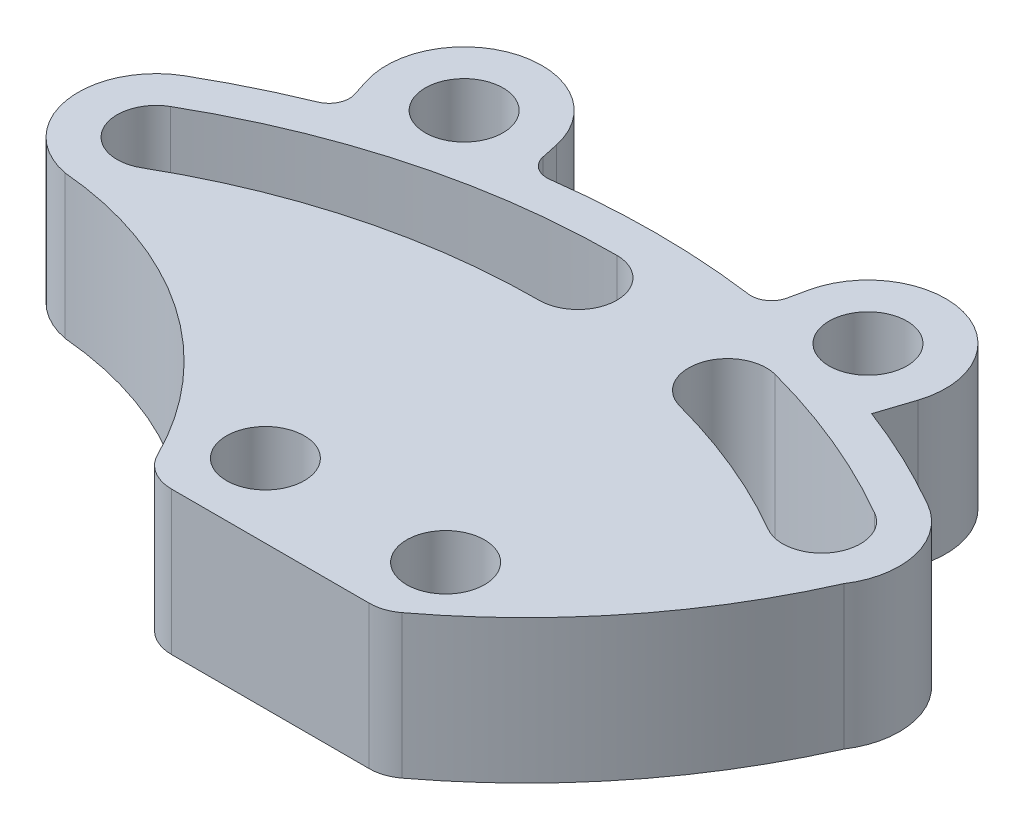
ISO-10303-21;
HEADER;
FILE_DESCRIPTION(('STEP AP214'),'2;1');
FILE_NAME('part.step','',(''),(''),'','','');
FILE_SCHEMA(('AUTOMOTIVE_DESIGN { 1 0 10303 214 1 1 1 1 }'));
ENDSEC;
DATA;
#1=APPLICATION_CONTEXT('core data for automotive mechanical design processes');
#2=APPLICATION_PROTOCOL_DEFINITION('international standard','automotive_design',2000,#1);
#3=PRODUCT_CONTEXT('',#1,'mechanical');
#4=PRODUCT('Part','Part','',(#3));
#5=PRODUCT_RELATED_PRODUCT_CATEGORY('part','',(#4));
#6=PRODUCT_DEFINITION_FORMATION('','',#4);
#7=PRODUCT_DEFINITION_CONTEXT('part definition',#1,'design');
#8=PRODUCT_DEFINITION('design','',#6,#7);
#9=PRODUCT_DEFINITION_SHAPE('','',#8);
#10=(LENGTH_UNIT() NAMED_UNIT(*) SI_UNIT(.MILLI.,.METRE.));
#11=(NAMED_UNIT(*) PLANE_ANGLE_UNIT() SI_UNIT($,.RADIAN.));
#12=(NAMED_UNIT(*) SI_UNIT($,.STERADIAN.) SOLID_ANGLE_UNIT());
#13=UNCERTAINTY_MEASURE_WITH_UNIT(LENGTH_MEASURE(1.E-05),#10,'distance_accuracy_value','');
#14=(GEOMETRIC_REPRESENTATION_CONTEXT(3) GLOBAL_UNCERTAINTY_ASSIGNED_CONTEXT((#13)) GLOBAL_UNIT_ASSIGNED_CONTEXT((#10,
#11,#12)) REPRESENTATION_CONTEXT('',''));
#15=CARTESIAN_POINT('',(0.,0.,0.));
#16=DIRECTION('',(0.,0.,1.));
#17=DIRECTION('',(1.,0.,0.));
#18=AXIS2_PLACEMENT_3D('',#15,#16,#17);
#19=CARTESIAN_POINT('',(21.3655121732125,17.78,-35.2871769601627));
#20=DIRECTION('',(0.,-1.,0.));
#21=DIRECTION('',(0.,0.,-1.));
#22=AXIS2_PLACEMENT_3D('',#19,#20,#21);
#23=CYLINDRICAL_SURFACE('',#22,4.826);
#24=CARTESIAN_POINT('',(21.3655121732125,0.,-35.2871769601627));
#25=DIRECTION('',(0.,1.,0.));
#26=DIRECTION('',(0.,0.,1.));
#27=AXIS2_PLACEMENT_3D('',#24,#25,#26);
#28=CIRCLE('',#27,4.826);
#29=CARTESIAN_POINT('',(22.6145728848773,0.,-39.9487349978338));
#30=VERTEX_POINT('',#29);
#31=CARTESIAN_POINT('',(20.1164514615478,0.,-30.6256189224917));
#32=VERTEX_POINT('',#31);
#33=EDGE_CURVE('E363',#30,#32,#28,.T.);
#34=ORIENTED_EDGE('',*,*,#33,.F.);
#35=DIRECTION('',(0.,-1.,0.));
#36=VECTOR('',#35,1.);
#37=CARTESIAN_POINT('',(22.6145728848773,17.78,-39.9487349978338));
#38=LINE('',#37,#36);
#39=CARTESIAN_POINT('',(22.6145728848773,17.78,-39.9487349978338));
#40=VERTEX_POINT('',#39);
#41=EDGE_CURVE('E11',#40,#30,#38,.T.);
#42=ORIENTED_EDGE('',*,*,#41,.F.);
#43=CARTESIAN_POINT('',(21.3655121732125,17.78,-35.2871769601627));
#44=DIRECTION('',(0.,1.,0.));
#45=DIRECTION('',(0.,0.,1.));
#46=AXIS2_PLACEMENT_3D('',#43,#44,#45);
#47=CIRCLE('',#46,4.826);
#48=CARTESIAN_POINT('',(20.1164514615478,17.78,-30.6256189224917));
#49=VERTEX_POINT('',#48);
#50=EDGE_CURVE('E248',#40,#49,#47,.T.);
#51=ORIENTED_EDGE('',*,*,#50,.T.);
#52=DIRECTION('',(0.,-1.,0.));
#53=VECTOR('',#52,1.);
#54=CARTESIAN_POINT('',(20.1164514615478,17.78,-30.6256189224917));
#55=LINE('',#54,#53);
#56=EDGE_CURVE('E154',#49,#32,#55,.T.);
#57=ORIENTED_EDGE('',*,*,#56,.T.);
#58=EDGE_LOOP('',(#34,#42,#51,#57));
#59=FACE_BOUND('',#58,.T.);
#60=ADVANCED_FACE('F43',(#59),#23,.F.);
#61=CARTESIAN_POINT('',(0.,17.78,44.45));
#62=DIRECTION('',(0.,-1.,0.));
#63=DIRECTION('',(0.,0.,-1.));
#64=AXIS2_PLACEMENT_3D('',#61,#62,#63);
#65=CYLINDRICAL_SURFACE('',#64,87.376);
#66=CARTESIAN_POINT('',(0.,0.,44.45));
#67=DIRECTION('',(0.,1.,0.));
#68=DIRECTION('',(0.,0.,1.));
#69=AXIS2_PLACEMENT_3D('',#66,#67,#68);
#70=CIRCLE('',#69,87.376);
#71=CARTESIAN_POINT('',(43.6879999999995,0.,-31.2198356810694));
#72=VERTEX_POINT('',#71);
#73=EDGE_CURVE('E238',#72,#30,#70,.T.);
#74=ORIENTED_EDGE('',*,*,#73,.F.);
#75=DIRECTION('',(0.,-1.,0.));
#76=VECTOR('',#75,1.);
#77=CARTESIAN_POINT('',(43.6879999999995,17.78,-31.2198356810694));
#78=LINE('',#77,#76);
#79=CARTESIAN_POINT('',(43.6879999999995,17.78,-31.2198356810694));
#80=VERTEX_POINT('',#79);
#81=EDGE_CURVE('E54',#80,#72,#78,.T.);
#82=ORIENTED_EDGE('',*,*,#81,.F.);
#83=CARTESIAN_POINT('',(0.,17.78,44.45));
#84=DIRECTION('',(0.,1.,0.));
#85=DIRECTION('',(0.,0.,1.));
#86=AXIS2_PLACEMENT_3D('',#83,#84,#85);
#87=CIRCLE('',#86,87.376);
#88=EDGE_CURVE('E236',#80,#40,#87,.T.);
#89=ORIENTED_EDGE('',*,*,#88,.T.);
#90=ORIENTED_EDGE('',*,*,#41,.T.);
#91=EDGE_LOOP('',(#74,#82,#89,#90));
#92=FACE_BOUND('',#91,.T.);
#93=ADVANCED_FACE('F235',(#92),#65,.F.);
#94=CARTESIAN_POINT('',(41.2749999999996,17.78,-27.0403970824057));
#95=DIRECTION('',(0.,-1.,0.));
#96=DIRECTION('',(0.,0.,-1.));
#97=AXIS2_PLACEMENT_3D('',#94,#95,#96);
#98=CYLINDRICAL_SURFACE('',#97,4.826);
#99=CARTESIAN_POINT('',(41.2749999999996,0.,-27.0403970824057));
#100=DIRECTION('',(0.,1.,0.));
#101=DIRECTION('',(0.,0.,1.));
#102=AXIS2_PLACEMENT_3D('',#99,#100,#101);
#103=CIRCLE('',#102,4.826);
#104=CARTESIAN_POINT('',(38.8619999999996,0.,-22.860958483742));
#105=VERTEX_POINT('',#104);
#106=EDGE_CURVE('E369',#105,#72,#103,.T.);
#107=ORIENTED_EDGE('',*,*,#106,.F.);
#108=DIRECTION('',(0.,-1.,0.));
#109=VECTOR('',#108,1.);
#110=CARTESIAN_POINT('',(38.8619999999996,17.78,-22.860958483742));
#111=LINE('',#110,#109);
#112=CARTESIAN_POINT('',(38.8619999999996,17.78,-22.860958483742));
#113=VERTEX_POINT('',#112);
#114=EDGE_CURVE('E147',#113,#105,#111,.T.);
#115=ORIENTED_EDGE('',*,*,#114,.F.);
#116=CARTESIAN_POINT('',(41.2749999999996,17.78,-27.0403970824057));
#117=DIRECTION('',(0.,1.,0.));
#118=DIRECTION('',(0.,0.,1.));
#119=AXIS2_PLACEMENT_3D('',#116,#117,#118);
#120=CIRCLE('',#119,4.826);
#121=EDGE_CURVE('E247',#113,#80,#120,.T.);
#122=ORIENTED_EDGE('',*,*,#121,.T.);
#123=ORIENTED_EDGE('',*,*,#81,.T.);
#124=EDGE_LOOP('',(#107,#115,#122,#123));
#125=FACE_BOUND('',#124,.T.);
#126=ADVANCED_FACE('F251',(#125),#98,.F.);
#127=CARTESIAN_POINT('',(-41.2749999999996,17.78,-27.0403970824057));
#128=DIRECTION('',(0.,-1.,0.));
#129=DIRECTION('',(0.,0.,-1.));
#130=AXIS2_PLACEMENT_3D('',#127,#128,#129);
#131=CYLINDRICAL_SURFACE('',#130,4.82599999999998);
#132=CARTESIAN_POINT('',(-41.2749999999996,0.,-27.0403970824057));
#133=DIRECTION('',(0.,1.,0.));
#134=DIRECTION('',(0.,0.,1.));
#135=AXIS2_PLACEMENT_3D('',#132,#133,#134);
#136=CIRCLE('',#135,4.82599999999998);
#137=CARTESIAN_POINT('',(-43.6879999999995,0.,-31.2198356810694));
#138=VERTEX_POINT('',#137);
#139=CARTESIAN_POINT('',(-38.8619999999996,0.,-22.860958483742));
#140=VERTEX_POINT('',#139);
#141=EDGE_CURVE('E347',#138,#140,#136,.T.);
#142=ORIENTED_EDGE('',*,*,#141,.F.);
#143=DIRECTION('',(0.,-1.,0.));
#144=VECTOR('',#143,1.);
#145=CARTESIAN_POINT('',(-43.6879999999995,17.78,-31.2198356810694));
#146=LINE('',#145,#144);
#147=CARTESIAN_POINT('',(-43.6879999999995,17.78,-31.2198356810694));
#148=VERTEX_POINT('',#147);
#149=EDGE_CURVE('E386',#148,#138,#146,.T.);
#150=ORIENTED_EDGE('',*,*,#149,.F.);
#151=CARTESIAN_POINT('',(-41.2749999999996,17.78,-27.0403970824057));
#152=DIRECTION('',(0.,1.,0.));
#153=DIRECTION('',(0.,0.,1.));
#154=AXIS2_PLACEMENT_3D('',#151,#152,#153);
#155=CIRCLE('',#154,4.82599999999998);
#156=CARTESIAN_POINT('',(-38.8619999999996,17.78,-22.860958483742));
#157=VERTEX_POINT('',#156);
#158=EDGE_CURVE('E614',#148,#157,#155,.T.);
#159=ORIENTED_EDGE('',*,*,#158,.T.);
#160=DIRECTION('',(0.,-1.,0.));
#161=VECTOR('',#160,1.);
#162=CARTESIAN_POINT('',(-38.8619999999996,17.78,-22.860958483742));
#163=LINE('',#162,#161);
#164=EDGE_CURVE('E389',#157,#140,#163,.T.);
#165=ORIENTED_EDGE('',*,*,#164,.T.);
#166=EDGE_LOOP('',(#142,#150,#159,#165));
#167=FACE_BOUND('',#166,.T.);
#168=ADVANCED_FACE('F660',(#167),#131,.F.);
#169=CARTESIAN_POINT('',(0.,17.78,44.45));
#170=DIRECTION('',(0.,-1.,0.));
#171=DIRECTION('',(0.,0.,-1.));
#172=AXIS2_PLACEMENT_3D('',#169,#170,#171);
#173=CYLINDRICAL_SURFACE('',#172,87.376);
#174=CARTESIAN_POINT('',(0.,0.,44.45));
#175=DIRECTION('',(0.,1.,0.));
#176=DIRECTION('',(0.,0.,1.));
#177=AXIS2_PLACEMENT_3D('',#174,#175,#176);
#178=CIRCLE('',#177,87.376);
#179=CARTESIAN_POINT('',(6.70347033469834E-13,0.,-42.926));
#180=VERTEX_POINT('',#179);
#181=EDGE_CURVE('E351',#180,#138,#178,.T.);
#182=ORIENTED_EDGE('',*,*,#181,.F.);
#183=DIRECTION('',(0.,-1.,0.));
#184=VECTOR('',#183,1.);
#185=CARTESIAN_POINT('',(6.70347033469834E-13,17.78,-42.926));
#186=LINE('',#185,#184);
#187=CARTESIAN_POINT('',(6.70347033469834E-13,17.78,-42.926));
#188=VERTEX_POINT('',#187);
#189=EDGE_CURVE('E395',#188,#180,#186,.T.);
#190=ORIENTED_EDGE('',*,*,#189,.F.);
#191=CARTESIAN_POINT('',(0.,17.78,44.45));
#192=DIRECTION('',(0.,1.,0.));
#193=DIRECTION('',(0.,0.,1.));
#194=AXIS2_PLACEMENT_3D('',#191,#192,#193);
#195=CIRCLE('',#194,87.376);
#196=EDGE_CURVE('E618',#188,#148,#195,.T.);
#197=ORIENTED_EDGE('',*,*,#196,.T.);
#198=ORIENTED_EDGE('',*,*,#149,.T.);
#199=EDGE_LOOP('',(#182,#190,#197,#198));
#200=FACE_BOUND('',#199,.T.);
#201=ADVANCED_FACE('F656',(#200),#173,.F.);
#202=CARTESIAN_POINT('',(6.38378239159465E-13,17.78,-38.1));
#203=DIRECTION('',(0.,-1.,0.));
#204=DIRECTION('',(0.,0.,-1.));
#205=AXIS2_PLACEMENT_3D('',#202,#203,#204);
#206=CYLINDRICAL_SURFACE('',#205,4.82599999999998);
#207=CARTESIAN_POINT('',(6.38378239159465E-13,0.,-38.1));
#208=DIRECTION('',(0.,1.,0.));
#209=DIRECTION('',(0.,0.,1.));
#210=AXIS2_PLACEMENT_3D('',#207,#208,#209);
#211=CIRCLE('',#210,4.82599999999998);
#212=CARTESIAN_POINT('',(5.61780680723873E-13,0.,-33.274));
#213=VERTEX_POINT('',#212);
#214=EDGE_CURVE('E355',#213,#180,#211,.T.);
#215=ORIENTED_EDGE('',*,*,#214,.F.);
#216=DIRECTION('',(0.,-1.,0.));
#217=VECTOR('',#216,1.);
#218=CARTESIAN_POINT('',(5.61780680723873E-13,17.78,-33.274));
#219=LINE('',#218,#217);
#220=CARTESIAN_POINT('',(5.61780680723873E-13,17.78,-33.274));
#221=VERTEX_POINT('',#220);
#222=EDGE_CURVE('E392',#221,#213,#219,.T.);
#223=ORIENTED_EDGE('',*,*,#222,.F.);
#224=CARTESIAN_POINT('',(6.38378239159465E-13,17.78,-38.1));
#225=DIRECTION('',(0.,1.,0.));
#226=DIRECTION('',(0.,0.,1.));
#227=AXIS2_PLACEMENT_3D('',#224,#225,#226);
#228=CIRCLE('',#227,4.82599999999998);
#229=EDGE_CURVE('E622',#221,#188,#228,.T.);
#230=ORIENTED_EDGE('',*,*,#229,.T.);
#231=ORIENTED_EDGE('',*,*,#189,.T.);
#232=EDGE_LOOP('',(#215,#223,#230,#231));
#233=FACE_BOUND('',#232,.T.);
#234=ADVANCED_FACE('F653',(#233),#206,.F.);
#235=CARTESIAN_POINT('',(25.0469542707506,17.78,-49.0265059132985));
#236=DIRECTION('',(0.,-1.,0.));
#237=DIRECTION('',(0.,0.,-1.));
#238=AXIS2_PLACEMENT_3D('',#235,#236,#237);
#239=CYLINDRICAL_SURFACE('',#238,9.652);
#240=CARTESIAN_POINT('',(25.0469542707506,0.,-49.0265059132985));
#241=DIRECTION('',(0.,1.,0.));
#242=DIRECTION('',(0.,0.,1.));
#243=AXIS2_PLACEMENT_3D('',#240,#241,#242);
#244=CIRCLE('',#243,9.652);
#245=CARTESIAN_POINT('',(15.6108599782656,0.,-51.0565868238364));
#246=VERTEX_POINT('',#245);
#247=CARTESIAN_POINT('',(34.2338920958171,0.,-46.0665604073197));
#248=VERTEX_POINT('',#247);
#249=EDGE_CURVE('E267',#246,#248,#244,.F.);
#250=ORIENTED_EDGE('',*,*,#249,.F.);
#251=DIRECTION('',(0.,-1.,0.));
#252=VECTOR('',#251,1.);
#253=CARTESIAN_POINT('',(15.6108599782656,17.78,-51.0565868238364));
#254=LINE('',#253,#252);
#255=CARTESIAN_POINT('',(15.6108599782656,17.78,-51.0565868238364));
#256=VERTEX_POINT('',#255);
#257=EDGE_CURVE('E47',#256,#246,#254,.T.);
#258=ORIENTED_EDGE('',*,*,#257,.F.);
#259=CARTESIAN_POINT('',(25.0469542707506,17.78,-49.0265059132985));
#260=DIRECTION('',(0.,1.,0.));
#261=DIRECTION('',(0.,0.,1.));
#262=AXIS2_PLACEMENT_3D('',#259,#260,#261);
#263=CIRCLE('',#262,9.652);
#264=CARTESIAN_POINT('',(34.2338920958171,17.78,-46.0665604073197));
#265=VERTEX_POINT('',#264);
#266=EDGE_CURVE('E383',#256,#265,#263,.F.);
#267=ORIENTED_EDGE('',*,*,#266,.T.);
#268=DIRECTION('',(0.,-1.,0.));
#269=VECTOR('',#268,1.);
#270=CARTESIAN_POINT('',(34.2338920958171,17.78,-46.0665604073197));
#271=LINE('',#270,#269);
#272=EDGE_CURVE('E266',#265,#248,#271,.T.);
#273=ORIENTED_EDGE('',*,*,#272,.T.);
#274=EDGE_LOOP('',(#250,#258,#267,#273));
#275=FACE_BOUND('',#274,.T.);
#276=ADVANCED_FACE('F45',(#275),#239,.T.);
#277=CARTESIAN_POINT('',(4.42188051072425,17.78,0.951323178346111));
#278=DIRECTION('',(0.977630987617603,0.,0.210327487623065));
#279=DIRECTION('',(0.210327487623065,0.,-0.977630987617603));
#280=AXIS2_PLACEMENT_3D('',#277,#278,#279);
#281=PLANE('',#280);
#282=DIRECTION('',(-0.210327487623065,0.,0.977630987617603));
#283=VECTOR('',#282,1.);
#284=CARTESIAN_POINT('',(4.42188051072425,0.,0.951323178346111));
#285=LINE('',#284,#283);
#286=CARTESIAN_POINT('',(15.1484819945726,0.,-48.9073905872487));
#287=VERTEX_POINT('',#286);
#288=EDGE_CURVE('E271',#246,#287,#285,.T.);
#289=ORIENTED_EDGE('',*,*,#288,.T.);
#290=DIRECTION('',(0.,-1.,0.));
#291=VECTOR('',#290,1.);
#292=CARTESIAN_POINT('',(15.1484819945726,17.78,-48.9073905872487));
#293=LINE('',#292,#291);
#294=CARTESIAN_POINT('',(15.1484819945726,17.78,-48.9073905872487));
#295=VERTEX_POINT('',#294);
#296=EDGE_CURVE('E452',#295,#287,#293,.T.);
#297=ORIENTED_EDGE('',*,*,#296,.F.);
#298=DIRECTION('',(-0.210327487623065,0.,0.977630987617603));
#299=VECTOR('',#298,1.);
#300=CARTESIAN_POINT('',(4.42188051072425,17.78,0.951323178346111));
#301=LINE('',#300,#299);
#302=EDGE_CURVE('E463',#256,#295,#301,.T.);
#303=ORIENTED_EDGE('',*,*,#302,.F.);
#304=ORIENTED_EDGE('',*,*,#257,.T.);
#305=EDGE_LOOP('',(#289,#297,#303,#304));
#306=FACE_BOUND('',#305,.T.);
#307=ADVANCED_FACE('F462',(#306),#281,.F.);
#308=CARTESIAN_POINT('',(12.6652992860238,17.78,-49.4416224058113));
#309=DIRECTION('',(0.,-1.,0.));
#310=DIRECTION('',(0.,0.,-1.));
#311=AXIS2_PLACEMENT_3D('',#308,#309,#310);
#312=CYLINDRICAL_SURFACE('',#311,2.53999999999999);
#313=CARTESIAN_POINT('',(12.6652992860238,0.,-49.4416224058113));
#314=DIRECTION('',(0.,1.,0.));
#315=DIRECTION('',(0.,0.,1.));
#316=AXIS2_PLACEMENT_3D('',#313,#314,#315);
#317=CIRCLE('',#316,2.53999999999999);
#318=CARTESIAN_POINT('',(12.3257470263449,0.,-46.9244207327332));
#319=VERTEX_POINT('',#318);
#320=EDGE_CURVE('E274',#287,#319,#317,.F.);
#321=ORIENTED_EDGE('',*,*,#320,.T.);
#322=DIRECTION('',(0.,-1.,0.));
#323=VECTOR('',#322,1.);
#324=CARTESIAN_POINT('',(12.3257470263449,17.78,-46.9244207327332));
#325=LINE('',#324,#323);
#326=CARTESIAN_POINT('',(12.3257470263449,17.78,-46.9244207327332));
#327=VERTEX_POINT('',#326);
#328=EDGE_CURVE('E449',#327,#319,#325,.T.);
#329=ORIENTED_EDGE('',*,*,#328,.F.);
#330=CARTESIAN_POINT('',(12.6652992860238,17.78,-49.4416224058113));
#331=DIRECTION('',(0.,1.,0.));
#332=DIRECTION('',(0.,0.,1.));
#333=AXIS2_PLACEMENT_3D('',#330,#331,#332);
#334=CIRCLE('',#333,2.53999999999999);
#335=EDGE_CURVE('E565',#295,#327,#334,.F.);
#336=ORIENTED_EDGE('',*,*,#335,.F.);
#337=ORIENTED_EDGE('',*,*,#296,.T.);
#338=EDGE_LOOP('',(#321,#329,#336,#337));
#339=FACE_BOUND('',#338,.T.);
#340=ADVANCED_FACE('F564',(#339),#312,.F.);
#341=CARTESIAN_POINT('',(0.,17.78,44.45));
#342=DIRECTION('',(0.,-1.,0.));
#343=DIRECTION('',(0.,0.,-1.));
#344=AXIS2_PLACEMENT_3D('',#341,#342,#343);
#345=CYLINDRICAL_SURFACE('',#344,92.202);
#346=CARTESIAN_POINT('',(0.,0.,44.45));
#347=DIRECTION('',(0.,1.,0.));
#348=DIRECTION('',(0.,0.,1.));
#349=AXIS2_PLACEMENT_3D('',#346,#347,#348);
#350=CIRCLE('',#349,92.202);
#351=CARTESIAN_POINT('',(-12.3257470263449,0.,-46.9244207327332));
#352=VERTEX_POINT('',#351);
#353=EDGE_CURVE('E277',#319,#352,#350,.T.);
#354=ORIENTED_EDGE('',*,*,#353,.T.);
#355=DIRECTION('',(0.,-1.,0.));
#356=VECTOR('',#355,1.);
#357=CARTESIAN_POINT('',(-12.3257470263449,17.78,-46.9244207327332));
#358=LINE('',#357,#356);
#359=CARTESIAN_POINT('',(-12.3257470263449,17.78,-46.9244207327332));
#360=VERTEX_POINT('',#359);
#361=EDGE_CURVE('E446',#360,#352,#358,.T.);
#362=ORIENTED_EDGE('',*,*,#361,.F.);
#363=CARTESIAN_POINT('',(0.,17.78,44.45));
#364=DIRECTION('',(0.,1.,0.));
#365=DIRECTION('',(0.,0.,1.));
#366=AXIS2_PLACEMENT_3D('',#363,#364,#365);
#367=CIRCLE('',#366,92.202);
#368=EDGE_CURVE('E563',#327,#360,#367,.T.);
#369=ORIENTED_EDGE('',*,*,#368,.F.);
#370=ORIENTED_EDGE('',*,*,#328,.T.);
#371=EDGE_LOOP('',(#354,#362,#369,#370));
#372=FACE_BOUND('',#371,.T.);
#373=ADVANCED_FACE('F561',(#372),#345,.T.);
#374=CARTESIAN_POINT('',(-12.6652992860239,17.78,-49.4416224058113));
#375=DIRECTION('',(0.,-1.,0.));
#376=DIRECTION('',(0.,0.,-1.));
#377=AXIS2_PLACEMENT_3D('',#374,#375,#376);
#378=CYLINDRICAL_SURFACE('',#377,2.54000000000001);
#379=CARTESIAN_POINT('',(-12.6652992860239,0.,-49.4416224058113));
#380=DIRECTION('',(0.,1.,0.));
#381=DIRECTION('',(0.,0.,1.));
#382=AXIS2_PLACEMENT_3D('',#379,#380,#381);
#383=CIRCLE('',#382,2.54000000000001);
#384=CARTESIAN_POINT('',(-15.1484819945726,0.,-48.9073905872487));
#385=VERTEX_POINT('',#384);
#386=EDGE_CURVE('E281',#385,#352,#383,.T.);
#387=ORIENTED_EDGE('',*,*,#386,.F.);
#388=DIRECTION('',(0.,-1.,0.));
#389=VECTOR('',#388,1.);
#390=CARTESIAN_POINT('',(-15.1484819945726,17.78,-48.9073905872487));
#391=LINE('',#390,#389);
#392=CARTESIAN_POINT('',(-15.1484819945726,17.78,-48.9073905872487));
#393=VERTEX_POINT('',#392);
#394=EDGE_CURVE('E443',#393,#385,#391,.T.);
#395=ORIENTED_EDGE('',*,*,#394,.F.);
#396=CARTESIAN_POINT('',(-12.6652992860239,17.78,-49.4416224058113));
#397=DIRECTION('',(0.,1.,0.));
#398=DIRECTION('',(0.,0.,1.));
#399=AXIS2_PLACEMENT_3D('',#396,#397,#398);
#400=CIRCLE('',#399,2.54000000000001);
#401=EDGE_CURVE('E558',#393,#360,#400,.T.);
#402=ORIENTED_EDGE('',*,*,#401,.T.);
#403=ORIENTED_EDGE('',*,*,#361,.T.);
#404=EDGE_LOOP('',(#387,#395,#402,#403));
#405=FACE_BOUND('',#404,.T.);
#406=ADVANCED_FACE('F556',(#405),#378,.F.);
#407=CARTESIAN_POINT('',(-4.42188051072322,17.78,0.951323178345984));
#408=DIRECTION('',(0.977630987617598,0.,-0.210327487623085));
#409=DIRECTION('',(-0.210327487623085,0.,-0.977630987617599));
#410=AXIS2_PLACEMENT_3D('',#407,#408,#409);
#411=PLANE('',#410);
#412=DIRECTION('',(0.210327487623085,0.,0.977630987617599));
#413=VECTOR('',#412,1.);
#414=CARTESIAN_POINT('',(-4.42188051072322,0.,0.951323178345984));
#415=LINE('',#414,#413);
#416=CARTESIAN_POINT('',(-15.6108599782656,0.,-51.0565868238363));
#417=VERTEX_POINT('',#416);
#418=EDGE_CURVE('E285',#417,#385,#415,.T.);
#419=ORIENTED_EDGE('',*,*,#418,.F.);
#420=DIRECTION('',(0.,-1.,0.));
#421=VECTOR('',#420,1.);
#422=CARTESIAN_POINT('',(-15.6108599782656,17.78,-51.0565868238363));
#423=LINE('',#422,#421);
#424=CARTESIAN_POINT('',(-15.6108599782656,17.78,-51.0565868238363));
#425=VERTEX_POINT('',#424);
#426=EDGE_CURVE('E440',#425,#417,#423,.T.);
#427=ORIENTED_EDGE('',*,*,#426,.F.);
#428=DIRECTION('',(0.210327487623085,0.,0.977630987617599));
#429=VECTOR('',#428,1.);
#430=CARTESIAN_POINT('',(-4.42188051072322,17.78,0.951323178345984));
#431=LINE('',#430,#429);
#432=EDGE_CURVE('E552',#425,#393,#431,.T.);
#433=ORIENTED_EDGE('',*,*,#432,.T.);
#434=ORIENTED_EDGE('',*,*,#394,.T.);
#435=EDGE_LOOP('',(#419,#427,#433,#434));
#436=FACE_BOUND('',#435,.T.);
#437=ADVANCED_FACE('F549',(#436),#411,.T.);
#438=CARTESIAN_POINT('',(-25.0469542707507,17.78,-49.0265059132985));
#439=DIRECTION('',(0.,-1.,0.));
#440=DIRECTION('',(0.,0.,-1.));
#441=AXIS2_PLACEMENT_3D('',#438,#439,#440);
#442=CYLINDRICAL_SURFACE('',#441,9.65200000000003);
#443=CARTESIAN_POINT('',(-25.0469542707507,0.,-49.0265059132985));
#444=DIRECTION('',(0.,1.,0.));
#445=DIRECTION('',(0.,0.,1.));
#446=AXIS2_PLACEMENT_3D('',#443,#444,#445);
#447=CIRCLE('',#446,9.65200000000003);
#448=CARTESIAN_POINT('',(-34.2338920958171,0.,-46.0665604073197));
#449=VERTEX_POINT('',#448);
#450=EDGE_CURVE('E289',#449,#417,#447,.F.);
#451=ORIENTED_EDGE('',*,*,#450,.F.);
#452=DIRECTION('',(0.,-1.,0.));
#453=VECTOR('',#452,1.);
#454=CARTESIAN_POINT('',(-34.2338920958171,17.78,-46.0665604073197));
#455=LINE('',#454,#453);
#456=CARTESIAN_POINT('',(-34.2338920958171,17.78,-46.0665604073197));
#457=VERTEX_POINT('',#456);
#458=EDGE_CURVE('E437',#457,#449,#455,.T.);
#459=ORIENTED_EDGE('',*,*,#458,.F.);
#460=CARTESIAN_POINT('',(-25.0469542707507,17.78,-49.0265059132985));
#461=DIRECTION('',(0.,1.,0.));
#462=DIRECTION('',(0.,0.,1.));
#463=AXIS2_PLACEMENT_3D('',#460,#461,#462);
#464=CIRCLE('',#463,9.65200000000003);
#465=EDGE_CURVE('E545',#457,#425,#464,.F.);
#466=ORIENTED_EDGE('',*,*,#465,.T.);
#467=ORIENTED_EDGE('',*,*,#426,.T.);
#468=EDGE_LOOP('',(#451,#459,#466,#467));
#469=FACE_BOUND('',#468,.T.);
#470=ADVANCED_FACE('F544',(#469),#442,.T.);
#471=CARTESIAN_POINT('',(-17.5679988233699,17.78,5.66024503011145));
#472=DIRECTION('',(0.951817014615251,0.,-0.306666546413056));
#473=DIRECTION('',(-0.306666546413056,0.,-0.951817014615251));
#474=AXIS2_PLACEMENT_3D('',#471,#472,#473);
#475=PLANE('',#474);
#476=DIRECTION('',(0.306666546413056,0.,0.951817014615251));
#477=VECTOR('',#476,1.);
#478=CARTESIAN_POINT('',(-17.5679988233699,0.,5.66024503011145));
#479=LINE('',#478,#477);
#480=CARTESIAN_POINT('',(-33.5597250575521,0.,-43.9741128768703));
#481=VERTEX_POINT('',#480);
#482=EDGE_CURVE('E293',#449,#481,#479,.T.);
#483=ORIENTED_EDGE('',*,*,#482,.T.);
#484=DIRECTION('',(0.,-1.,0.));
#485=VECTOR('',#484,1.);
#486=CARTESIAN_POINT('',(-33.5597250575521,17.78,-43.9741128768703));
#487=LINE('',#486,#485);
#488=CARTESIAN_POINT('',(-33.5597250575521,17.78,-43.9741128768703));
#489=VERTEX_POINT('',#488);
#490=EDGE_CURVE('E434',#489,#481,#487,.T.);
#491=ORIENTED_EDGE('',*,*,#490,.F.);
#492=DIRECTION('',(0.306666546413056,0.,0.951817014615251));
#493=VECTOR('',#492,1.);
#494=CARTESIAN_POINT('',(-17.5679988233699,17.78,5.66024503011145));
#495=LINE('',#494,#493);
#496=EDGE_CURVE('E540',#457,#489,#495,.T.);
#497=ORIENTED_EDGE('',*,*,#496,.F.);
#498=ORIENTED_EDGE('',*,*,#458,.T.);
#499=EDGE_LOOP('',(#483,#491,#497,#498));
#500=FACE_BOUND('',#499,.T.);
#501=ADVANCED_FACE('F539',(#500),#475,.F.);
#502=CARTESIAN_POINT('',(-35.9773402746749,17.78,-43.1951798489812));
#503=DIRECTION('',(0.,-1.,0.));
#504=DIRECTION('',(0.,0.,-1.));
#505=AXIS2_PLACEMENT_3D('',#502,#503,#504);
#506=CYLINDRICAL_SURFACE('',#505,2.54000000000002);
#507=CARTESIAN_POINT('',(-35.9773402746749,0.,-43.1951798489812));
#508=DIRECTION('',(0.,1.,0.));
#509=DIRECTION('',(0.,0.,1.));
#510=AXIS2_PLACEMENT_3D('',#507,#508,#509);
#511=CIRCLE('',#510,2.54000000000002);
#512=CARTESIAN_POINT('',(-35.0128003209303,0.,-40.8454431238074));
#513=VERTEX_POINT('',#512);
#514=EDGE_CURVE('E297',#513,#481,#511,.T.);
#515=ORIENTED_EDGE('',*,*,#514,.F.);
#516=DIRECTION('',(0.,-1.,0.));
#517=VECTOR('',#516,1.);
#518=CARTESIAN_POINT('',(-35.0128003209303,17.78,-40.8454431238074));
#519=LINE('',#518,#517);
#520=CARTESIAN_POINT('',(-35.0128003209303,17.78,-40.8454431238074));
#521=VERTEX_POINT('',#520);
#522=EDGE_CURVE('E431',#521,#513,#519,.T.);
#523=ORIENTED_EDGE('',*,*,#522,.F.);
#524=CARTESIAN_POINT('',(-35.9773402746749,17.78,-43.1951798489812));
#525=DIRECTION('',(0.,1.,0.));
#526=DIRECTION('',(0.,0.,1.));
#527=AXIS2_PLACEMENT_3D('',#524,#525,#526);
#528=CIRCLE('',#527,2.54000000000002);
#529=EDGE_CURVE('E536',#521,#489,#528,.T.);
#530=ORIENTED_EDGE('',*,*,#529,.T.);
#531=ORIENTED_EDGE('',*,*,#490,.T.);
#532=EDGE_LOOP('',(#515,#523,#530,#531));
#533=FACE_BOUND('',#532,.T.);
#534=ADVANCED_FACE('F532',(#533),#506,.F.);
#535=CARTESIAN_POINT('',(0.,17.78,44.45));
#536=DIRECTION('',(0.,-1.,0.));
#537=DIRECTION('',(0.,0.,-1.));
#538=AXIS2_PLACEMENT_3D('',#535,#536,#537);
#539=CYLINDRICAL_SURFACE('',#538,92.202);
#540=CARTESIAN_POINT('',(0.,0.,44.45));
#541=DIRECTION('',(0.,1.,0.));
#542=DIRECTION('',(0.,0.,1.));
#543=AXIS2_PLACEMENT_3D('',#540,#541,#542);
#544=CIRCLE('',#543,92.202);
#545=CARTESIAN_POINT('',(-46.1009999999995,0.,-35.3992742797331));
#546=VERTEX_POINT('',#545);
#547=EDGE_CURVE('E301',#546,#513,#544,.F.);
#548=ORIENTED_EDGE('',*,*,#547,.F.);
#549=DIRECTION('',(0.,-1.,0.));
#550=VECTOR('',#549,1.);
#551=CARTESIAN_POINT('',(-46.1009999999995,17.78,-35.3992742797331));
#552=LINE('',#551,#550);
#553=CARTESIAN_POINT('',(-46.1009999999995,17.78,-35.3992742797331));
#554=VERTEX_POINT('',#553);
#555=EDGE_CURVE('E428',#554,#546,#552,.T.);
#556=ORIENTED_EDGE('',*,*,#555,.F.);
#557=CARTESIAN_POINT('',(0.,17.78,44.45));
#558=DIRECTION('',(0.,1.,0.));
#559=DIRECTION('',(0.,0.,1.));
#560=AXIS2_PLACEMENT_3D('',#557,#558,#559);
#561=CIRCLE('',#560,92.202);
#562=EDGE_CURVE('E527',#554,#521,#561,.F.);
#563=ORIENTED_EDGE('',*,*,#562,.T.);
#564=ORIENTED_EDGE('',*,*,#522,.T.);
#565=EDGE_LOOP('',(#548,#556,#563,#564));
#566=FACE_BOUND('',#565,.T.);
#567=ADVANCED_FACE('F526',(#566),#539,.T.);
#568=CARTESIAN_POINT('',(-41.2749999999996,17.78,-27.0403970824057));
#569=DIRECTION('',(0.,-1.,0.));
#570=DIRECTION('',(0.,0.,-1.));
#571=AXIS2_PLACEMENT_3D('',#568,#569,#570);
#572=CYLINDRICAL_SURFACE('',#571,9.65199999999997);
#573=CARTESIAN_POINT('',(-41.2749999999996,0.,-27.0403970824057));
#574=DIRECTION('',(0.,1.,0.));
#575=DIRECTION('',(0.,0.,1.));
#576=AXIS2_PLACEMENT_3D('',#573,#574,#575);
#577=CIRCLE('',#576,9.65199999999997);
#578=CARTESIAN_POINT('',(-43.07696377623,0.,-17.5580961723336));
#579=VERTEX_POINT('',#578);
#580=EDGE_CURVE('E305',#546,#579,#577,.T.);
#581=ORIENTED_EDGE('',*,*,#580,.T.);
#582=DIRECTION('',(0.,-1.,0.));
#583=VECTOR('',#582,1.);
#584=CARTESIAN_POINT('',(-43.07696377623,17.78,-17.5580961723336));
#585=LINE('',#584,#583);
#586=CARTESIAN_POINT('',(-43.07696377623,17.78,-17.5580961723336));
#587=VERTEX_POINT('',#586);
#588=EDGE_CURVE('E424',#587,#579,#585,.T.);
#589=ORIENTED_EDGE('',*,*,#588,.F.);
#590=CARTESIAN_POINT('',(-41.2749999999996,17.78,-27.0403970824057));
#591=DIRECTION('',(0.,1.,0.));
#592=DIRECTION('',(0.,0.,1.));
#593=AXIS2_PLACEMENT_3D('',#590,#591,#592);
#594=CIRCLE('',#593,9.65199999999997);
#595=EDGE_CURVE('E522',#554,#587,#594,.T.);
#596=ORIENTED_EDGE('',*,*,#595,.F.);
#597=ORIENTED_EDGE('',*,*,#555,.T.);
#598=EDGE_LOOP('',(#581,#589,#596,#597));
#599=FACE_BOUND('',#598,.T.);
#600=ADVANCED_FACE('F521',(#599),#572,.T.);
#601=CARTESIAN_POINT('',(-46.8857601776321,17.78,26.7284206242336));
#602=DIRECTION('',(0.,-1.,0.));
#603=DIRECTION('',(0.,0.,-1.));
#604=AXIS2_PLACEMENT_3D('',#601,#602,#603);
#605=CYLINDRICAL_SURFACE('',#604,44.4499999999994);
#606=CARTESIAN_POINT('',(-46.8857601776321,0.,26.7284206242336));
#607=DIRECTION('',(0.,1.,0.));
#608=DIRECTION('',(0.,0.,1.));
#609=AXIS2_PLACEMENT_3D('',#606,#607,#608);
#610=CIRCLE('',#609,44.4499999999994);
#611=CARTESIAN_POINT('',(-7.06547001440866,0.,6.97628171937983));
#612=VERTEX_POINT('',#611);
#613=EDGE_CURVE('E308',#579,#612,#610,.F.);
#614=ORIENTED_EDGE('',*,*,#613,.T.);
#615=DIRECTION('',(0.,-1.,0.));
#616=VECTOR('',#615,1.);
#617=CARTESIAN_POINT('',(-7.06547001440866,17.78,6.97628171937983));
#618=LINE('',#617,#616);
#619=CARTESIAN_POINT('',(-7.06547001440866,17.78,6.97628171937983));
#620=VERTEX_POINT('',#619);
#621=EDGE_CURVE('E421',#620,#612,#618,.T.);
#622=ORIENTED_EDGE('',*,*,#621,.F.);
#623=CARTESIAN_POINT('',(-46.8857601776321,17.78,26.7284206242336));
#624=DIRECTION('',(0.,1.,0.));
#625=DIRECTION('',(0.,0.,1.));
#626=AXIS2_PLACEMENT_3D('',#623,#624,#625);
#627=CIRCLE('',#626,44.4499999999994);
#628=EDGE_CURVE('E518',#587,#620,#627,.F.);
#629=ORIENTED_EDGE('',*,*,#628,.F.);
#630=ORIENTED_EDGE('',*,*,#588,.T.);
#631=EDGE_LOOP('',(#614,#622,#629,#630));
#632=FACE_BOUND('',#631,.T.);
#633=ADVANCED_FACE('F515',(#632),#605,.F.);
#634=CARTESIAN_POINT('',(-2.51457971003822,17.78,4.71889441596698));
#635=DIRECTION('',(0.,-1.,0.));
#636=DIRECTION('',(0.,0.,-1.));
#637=AXIS2_PLACEMENT_3D('',#634,#635,#636);
#638=CYLINDRICAL_SURFACE('',#637,5.08000000000172);
#639=CARTESIAN_POINT('',(-2.51457971003822,0.,4.71889441596698));
#640=DIRECTION('',(0.,1.,0.));
#641=DIRECTION('',(0.,0.,1.));
#642=AXIS2_PLACEMENT_3D('',#639,#640,#641);
#643=CIRCLE('',#642,5.08000000000172);
#644=CARTESIAN_POINT('',(-2.51457971004034,0.,9.79889441596805));
#645=VERTEX_POINT('',#644);
#646=EDGE_CURVE('E312',#645,#612,#643,.F.);
#647=ORIENTED_EDGE('',*,*,#646,.F.);
#648=DIRECTION('',(0.,-1.,0.));
#649=VECTOR('',#648,1.);
#650=CARTESIAN_POINT('',(-2.51457971004034,17.78,9.79889441596805));
#651=LINE('',#650,#649);
#652=CARTESIAN_POINT('',(-2.51457971004034,17.78,9.79889441596805));
#653=VERTEX_POINT('',#652);
#654=EDGE_CURVE('E418',#653,#645,#651,.T.);
#655=ORIENTED_EDGE('',*,*,#654,.F.);
#656=CARTESIAN_POINT('',(-2.51457971003822,17.78,4.71889441596698));
#657=DIRECTION('',(0.,1.,0.));
#658=DIRECTION('',(0.,0.,1.));
#659=AXIS2_PLACEMENT_3D('',#656,#657,#658);
#660=CIRCLE('',#659,5.08000000000172);
#661=EDGE_CURVE('E509',#653,#620,#660,.F.);
#662=ORIENTED_EDGE('',*,*,#661,.T.);
#663=ORIENTED_EDGE('',*,*,#621,.T.);
#664=EDGE_LOOP('',(#647,#655,#662,#663));
#665=FACE_BOUND('',#664,.T.);
#666=ADVANCED_FACE('F508',(#665),#638,.T.);
#667=CARTESIAN_POINT('',(6.19750946284831E-13,17.78,9.79889441596789));
#668=DIRECTION('',(0.,0.,-1.));
#669=DIRECTION('',(-1.,0.,0.));
#670=AXIS2_PLACEMENT_3D('',#667,#668,#669);
#671=PLANE('',#670);
#672=DIRECTION('',(1.,0.,0.));
#673=VECTOR('',#672,1.);
#674=CARTESIAN_POINT('',(6.19750946284831E-13,0.,9.79889441596789));
#675=LINE('',#674,#673);
#676=CARTESIAN_POINT('',(22.0058261429935,0.,9.7988944159665));
#677=VERTEX_POINT('',#676);
#678=EDGE_CURVE('E316',#645,#677,#675,.T.);
#679=ORIENTED_EDGE('',*,*,#678,.T.);
#680=DIRECTION('',(0.,-1.,0.));
#681=VECTOR('',#680,1.);
#682=CARTESIAN_POINT('',(22.0058261429935,17.78,9.7988944159665));
#683=LINE('',#682,#681);
#684=CARTESIAN_POINT('',(22.0058261429935,17.78,9.7988944159665));
#685=VERTEX_POINT('',#684);
#686=EDGE_CURVE('E414',#685,#677,#683,.T.);
#687=ORIENTED_EDGE('',*,*,#686,.F.);
#688=DIRECTION('',(1.,0.,0.));
#689=VECTOR('',#688,1.);
#690=CARTESIAN_POINT('',(6.19750946284831E-13,17.78,9.79889441596789));
#691=LINE('',#690,#689);
#692=EDGE_CURVE('E504',#653,#685,#691,.T.);
#693=ORIENTED_EDGE('',*,*,#692,.F.);
#694=ORIENTED_EDGE('',*,*,#654,.T.);
#695=EDGE_LOOP('',(#679,#687,#693,#694));
#696=FACE_BOUND('',#695,.T.);
#697=ADVANCED_FACE('F503',(#696),#671,.F.);
#698=CARTESIAN_POINT('',(22.0058261429934,17.78,4.7188944159665));
#699=DIRECTION('',(0.,-1.,0.));
#700=DIRECTION('',(0.,0.,-1.));
#701=AXIS2_PLACEMENT_3D('',#698,#699,#700);
#702=CYLINDRICAL_SURFACE('',#701,5.08000000000062);
#703=CARTESIAN_POINT('',(22.0058261429934,0.,4.7188944159665));
#704=DIRECTION('',(0.,1.,0.));
#705=DIRECTION('',(0.,0.,1.));
#706=AXIS2_PLACEMENT_3D('',#703,#704,#705);
#707=CIRCLE('',#706,5.08000000000062);
#708=CARTESIAN_POINT('',(25.0606048013998,0.,8.7778015777721));
#709=VERTEX_POINT('',#708);
#710=EDGE_CURVE('E319',#677,#709,#707,.T.);
#711=ORIENTED_EDGE('',*,*,#710,.T.);
#712=DIRECTION('',(0.,-1.,0.));
#713=VECTOR('',#712,1.);
#714=CARTESIAN_POINT('',(25.0606048013998,17.78,8.7778015777721));
#715=LINE('',#714,#713);
#716=CARTESIAN_POINT('',(25.0606048013998,17.78,8.7778015777721));
#717=VERTEX_POINT('',#716);
#718=EDGE_CURVE('E411',#717,#709,#715,.T.);
#719=ORIENTED_EDGE('',*,*,#718,.F.);
#720=CARTESIAN_POINT('',(22.0058261429934,17.78,4.7188944159665));
#721=DIRECTION('',(0.,1.,0.));
#722=DIRECTION('',(0.,0.,1.));
#723=AXIS2_PLACEMENT_3D('',#720,#721,#722);
#724=CIRCLE('',#723,5.08000000000062);
#725=EDGE_CURVE('E500',#685,#717,#724,.T.);
#726=ORIENTED_EDGE('',*,*,#725,.F.);
#727=ORIENTED_EDGE('',*,*,#686,.T.);
#728=EDGE_LOOP('',(#711,#719,#726,#727));
#729=FACE_BOUND('',#728,.T.);
#730=ADVANCED_FACE('F497',(#729),#702,.T.);
#731=CARTESIAN_POINT('',(-21.6775086722185,17.78,-53.3234779978315));
#732=DIRECTION('',(0.,-1.,0.));
#733=DIRECTION('',(0.,0.,-1.));
#734=AXIS2_PLACEMENT_3D('',#731,#732,#733);
#735=CYLINDRICAL_SURFACE('',#734,77.7240000000007);
#736=CARTESIAN_POINT('',(-21.6775086722185,0.,-53.3234779978315));
#737=DIRECTION('',(0.,1.,0.));
#738=DIRECTION('',(0.,0.,1.));
#739=AXIS2_PLACEMENT_3D('',#736,#737,#738);
#740=CIRCLE('',#739,77.7240000000007);
#741=CARTESIAN_POINT('',(49.3374453043261,0.,-21.733978354606));
#742=VERTEX_POINT('',#741);
#743=EDGE_CURVE('E323',#742,#709,#740,.F.);
#744=ORIENTED_EDGE('',*,*,#743,.F.);
#745=DIRECTION('',(0.,-1.,0.));
#746=VECTOR('',#745,1.);
#747=CARTESIAN_POINT('',(49.3374453043261,17.78,-21.733978354606));
#748=LINE('',#747,#746);
#749=CARTESIAN_POINT('',(49.3374453043261,17.78,-21.733978354606));
#750=VERTEX_POINT('',#749);
#751=EDGE_CURVE('E408',#750,#742,#748,.T.);
#752=ORIENTED_EDGE('',*,*,#751,.F.);
#753=CARTESIAN_POINT('',(-21.6775086722185,17.78,-53.3234779978315));
#754=DIRECTION('',(0.,1.,0.));
#755=DIRECTION('',(0.,0.,1.));
#756=AXIS2_PLACEMENT_3D('',#753,#754,#755);
#757=CIRCLE('',#756,77.7240000000007);
#758=EDGE_CURVE('E597',#750,#717,#757,.F.);
#759=ORIENTED_EDGE('',*,*,#758,.T.);
#760=ORIENTED_EDGE('',*,*,#718,.T.);
#761=EDGE_LOOP('',(#744,#752,#759,#760));
#762=FACE_BOUND('',#761,.T.);
#763=ADVANCED_FACE('F491',(#762),#735,.T.);
#764=CARTESIAN_POINT('',(41.2749999999996,17.78,-27.0403970824057));
#765=DIRECTION('',(0.,-1.,0.));
#766=DIRECTION('',(0.,0.,-1.));
#767=AXIS2_PLACEMENT_3D('',#764,#765,#766);
#768=CYLINDRICAL_SURFACE('',#767,9.65199999999998);
#769=CARTESIAN_POINT('',(41.2749999999996,0.,-27.0403970824057));
#770=DIRECTION('',(0.,1.,0.));
#771=DIRECTION('',(0.,0.,1.));
#772=AXIS2_PLACEMENT_3D('',#769,#770,#771);
#773=CIRCLE('',#772,9.65199999999998);
#774=CARTESIAN_POINT('',(46.1009999999995,0.,-35.3992742797331));
#775=VERTEX_POINT('',#774);
#776=EDGE_CURVE('E327',#775,#742,#773,.F.);
#777=ORIENTED_EDGE('',*,*,#776,.F.);
#778=DIRECTION('',(0.,-1.,0.));
#779=VECTOR('',#778,1.);
#780=CARTESIAN_POINT('',(46.1009999999995,17.78,-35.3992742797331));
#781=LINE('',#780,#779);
#782=CARTESIAN_POINT('',(46.1009999999995,17.78,-35.3992742797331));
#783=VERTEX_POINT('',#782);
#784=EDGE_CURVE('E405',#783,#775,#781,.T.);
#785=ORIENTED_EDGE('',*,*,#784,.F.);
#786=CARTESIAN_POINT('',(41.2749999999996,17.78,-27.0403970824057));
#787=DIRECTION('',(0.,1.,0.));
#788=DIRECTION('',(0.,0.,1.));
#789=AXIS2_PLACEMENT_3D('',#786,#787,#788);
#790=CIRCLE('',#789,9.65199999999998);
#791=EDGE_CURVE('E487',#783,#750,#790,.F.);
#792=ORIENTED_EDGE('',*,*,#791,.T.);
#793=ORIENTED_EDGE('',*,*,#751,.T.);
#794=EDGE_LOOP('',(#777,#785,#792,#793));
#795=FACE_BOUND('',#794,.T.);
#796=ADVANCED_FACE('F485',(#795),#768,.T.);
#797=CARTESIAN_POINT('',(0.,17.78,44.45));
#798=DIRECTION('',(0.,-1.,0.));
#799=DIRECTION('',(0.,0.,-1.));
#800=AXIS2_PLACEMENT_3D('',#797,#798,#799);
#801=CYLINDRICAL_SURFACE('',#800,92.202);
#802=CARTESIAN_POINT('',(0.,0.,44.45));
#803=DIRECTION('',(0.,1.,0.));
#804=DIRECTION('',(0.,0.,1.));
#805=AXIS2_PLACEMENT_3D('',#802,#803,#804);
#806=CIRCLE('',#805,92.202);
#807=CARTESIAN_POINT('',(32.812957113469,0.,-41.715646573734));
#808=VERTEX_POINT('',#807);
#809=EDGE_CURVE('E331',#808,#775,#806,.F.);
#810=ORIENTED_EDGE('',*,*,#809,.F.);
#811=DIRECTION('',(0.,-1.,0.));
#812=VECTOR('',#811,1.);
#813=CARTESIAN_POINT('',(32.812957113469,17.78,-41.715646573734));
#814=LINE('',#813,#812);
#815=CARTESIAN_POINT('',(32.812957113469,17.78,-41.715646573734));
#816=VERTEX_POINT('',#815);
#817=EDGE_CURVE('E402',#816,#808,#814,.T.);
#818=ORIENTED_EDGE('',*,*,#817,.F.);
#819=CARTESIAN_POINT('',(0.,17.78,44.45));
#820=DIRECTION('',(0.,1.,0.));
#821=DIRECTION('',(0.,0.,1.));
#822=AXIS2_PLACEMENT_3D('',#819,#820,#821);
#823=CIRCLE('',#822,92.202);
#824=EDGE_CURVE('E481',#816,#783,#823,.F.);
#825=ORIENTED_EDGE('',*,*,#824,.T.);
#826=ORIENTED_EDGE('',*,*,#784,.T.);
#827=EDGE_LOOP('',(#810,#818,#825,#826));
#828=FACE_BOUND('',#827,.T.);
#829=ADVANCED_FACE('F478',(#828),#801,.T.);
#830=CARTESIAN_POINT('',(-25.0469542707507,17.78,-49.0265059132985));
#831=DIRECTION('',(0.,-1.,0.));
#832=DIRECTION('',(0.,0.,-1.));
#833=AXIS2_PLACEMENT_3D('',#830,#831,#832);
#834=CYLINDRICAL_SURFACE('',#833,4.82599999999999);
#835=CARTESIAN_POINT('',(-25.0469542707507,17.78,-49.0265059132985));
#836=DIRECTION('',(0.,1.,0.));
#837=DIRECTION('',(0.,0.,1.));
#838=AXIS2_PLACEMENT_3D('',#835,#836,#837);
#839=CIRCLE('',#838,4.82599999999999);
#840=CARTESIAN_POINT('',(-25.0469542707507,17.78,-44.2005059132985));
#841=VERTEX_POINT('',#840);
#842=EDGE_CURVE('E255',#841,#841,#839,.T.);
#843=ORIENTED_EDGE('',*,*,#842,.T.);
#844=EDGE_LOOP('',(#843));
#845=FACE_BOUND('',#844,.T.);
#846=CARTESIAN_POINT('',(-25.0469542707507,0.,-49.0265059132985));
#847=DIRECTION('',(0.,1.,0.));
#848=DIRECTION('',(0.,0.,1.));
#849=AXIS2_PLACEMENT_3D('',#846,#847,#848);
#850=CIRCLE('',#849,4.82599999999999);
#851=CARTESIAN_POINT('',(-25.0469542707507,0.,-44.2005059132985));
#852=VERTEX_POINT('',#851);
#853=EDGE_CURVE('E375',#852,#852,#850,.T.);
#854=ORIENTED_EDGE('',*,*,#853,.F.);
#855=EDGE_LOOP('',(#854));
#856=FACE_BOUND('',#855,.T.);
#857=ADVANCED_FACE('F634',(#845,#856),#834,.F.);
#858=CARTESIAN_POINT('',(0.,17.78,44.45));
#859=DIRECTION('',(0.,-1.,0.));
#860=DIRECTION('',(0.,0.,-1.));
#861=AXIS2_PLACEMENT_3D('',#858,#859,#860);
#862=CYLINDRICAL_SURFACE('',#861,77.724);
#863=CARTESIAN_POINT('',(0.,0.,44.45));
#864=DIRECTION('',(0.,1.,0.));
#865=DIRECTION('',(0.,0.,1.));
#866=AXIS2_PLACEMENT_3D('',#863,#864,#865);
#867=CIRCLE('',#866,77.724);
#868=EDGE_CURVE('E372',#105,#32,#867,.T.);
#869=ORIENTED_EDGE('',*,*,#868,.T.);
#870=ORIENTED_EDGE('',*,*,#56,.F.);
#871=CARTESIAN_POINT('',(0.,17.78,44.45));
#872=DIRECTION('',(0.,1.,0.));
#873=DIRECTION('',(0.,0.,1.));
#874=AXIS2_PLACEMENT_3D('',#871,#872,#873);
#875=CIRCLE('',#874,77.724);
#876=EDGE_CURVE('E63',#113,#49,#875,.T.);
#877=ORIENTED_EDGE('',*,*,#876,.F.);
#878=ORIENTED_EDGE('',*,*,#114,.T.);
#879=EDGE_LOOP('',(#869,#870,#877,#878));
#880=FACE_BOUND('',#879,.T.);
#881=ADVANCED_FACE('F631',(#880),#862,.T.);
#882=CARTESIAN_POINT('',(0.,17.78,44.45));
#883=DIRECTION('',(0.,-1.,0.));
#884=DIRECTION('',(0.,0.,-1.));
#885=AXIS2_PLACEMENT_3D('',#882,#883,#884);
#886=CYLINDRICAL_SURFACE('',#885,77.724);
#887=CARTESIAN_POINT('',(0.,0.,44.45));
#888=DIRECTION('',(0.,1.,0.));
#889=DIRECTION('',(0.,0.,1.));
#890=AXIS2_PLACEMENT_3D('',#887,#888,#889);
#891=CIRCLE('',#890,77.724);
#892=EDGE_CURVE('E359',#213,#140,#891,.T.);
#893=ORIENTED_EDGE('',*,*,#892,.T.);
#894=ORIENTED_EDGE('',*,*,#164,.F.);
#895=CARTESIAN_POINT('',(0.,17.78,44.45));
#896=DIRECTION('',(0.,1.,0.));
#897=DIRECTION('',(0.,0.,1.));
#898=AXIS2_PLACEMENT_3D('',#895,#896,#897);
#899=CIRCLE('',#898,77.724);
#900=EDGE_CURVE('E626',#221,#157,#899,.T.);
#901=ORIENTED_EDGE('',*,*,#900,.F.);
#902=ORIENTED_EDGE('',*,*,#222,.T.);
#903=EDGE_LOOP('',(#893,#894,#901,#902));
#904=FACE_BOUND('',#903,.T.);
#905=ADVANCED_FACE('F633',(#904),#886,.T.);
#906=CARTESIAN_POINT('',(22.352,17.78,0.668228958868478));
#907=DIRECTION('',(0.,-1.,0.));
#908=DIRECTION('',(0.,0.,-1.));
#909=AXIS2_PLACEMENT_3D('',#906,#907,#908);
#910=CYLINDRICAL_SURFACE('',#909,4.826);
#911=CARTESIAN_POINT('',(22.352,17.78,0.668228958868478));
#912=DIRECTION('',(0.,1.,0.));
#913=DIRECTION('',(0.,0.,1.));
#914=AXIS2_PLACEMENT_3D('',#911,#912,#913);
#915=CIRCLE('',#914,4.826);
#916=CARTESIAN_POINT('',(22.352,17.78,5.49422895886847));
#917=VERTEX_POINT('',#916);
#918=EDGE_CURVE('E610',#917,#917,#915,.T.);
#919=ORIENTED_EDGE('',*,*,#918,.T.);
#920=EDGE_LOOP('',(#919));
#921=FACE_BOUND('',#920,.T.);
#922=CARTESIAN_POINT('',(22.352,0.,0.668228958868478));
#923=DIRECTION('',(0.,1.,0.));
#924=DIRECTION('',(0.,0.,1.));
#925=AXIS2_PLACEMENT_3D('',#922,#923,#924);
#926=CIRCLE('',#925,4.826);
#927=CARTESIAN_POINT('',(22.352,0.,5.49422895886847));
#928=VERTEX_POINT('',#927);
#929=EDGE_CURVE('E343',#928,#928,#926,.T.);
#930=ORIENTED_EDGE('',*,*,#929,.F.);
#931=EDGE_LOOP('',(#930));
#932=FACE_BOUND('',#931,.T.);
#933=ADVANCED_FACE('F640',(#921,#932),#910,.F.);
#934=CARTESIAN_POINT('',(0.,17.78,0.668228958868478));
#935=DIRECTION('',(0.,-1.,0.));
#936=DIRECTION('',(0.,0.,-1.));
#937=AXIS2_PLACEMENT_3D('',#934,#935,#936);
#938=CYLINDRICAL_SURFACE('',#937,4.826);
#939=CARTESIAN_POINT('',(0.,17.78,0.668228958868478));
#940=DIRECTION('',(0.,1.,0.));
#941=DIRECTION('',(0.,0.,1.));
#942=AXIS2_PLACEMENT_3D('',#939,#940,#941);
#943=CIRCLE('',#942,4.826);
#944=CARTESIAN_POINT('',(0.,17.78,5.49422895886848));
#945=VERTEX_POINT('',#944);
#946=EDGE_CURVE('E606',#945,#945,#943,.T.);
#947=ORIENTED_EDGE('',*,*,#946,.T.);
#948=EDGE_LOOP('',(#947));
#949=FACE_BOUND('',#948,.T.);
#950=CARTESIAN_POINT('',(0.,0.,0.668228958868478));
#951=DIRECTION('',(0.,1.,0.));
#952=DIRECTION('',(0.,0.,1.));
#953=AXIS2_PLACEMENT_3D('',#950,#951,#952);
#954=CIRCLE('',#953,4.826);
#955=CARTESIAN_POINT('',(0.,0.,5.49422895886848));
#956=VERTEX_POINT('',#955);
#957=EDGE_CURVE('E339',#956,#956,#954,.T.);
#958=ORIENTED_EDGE('',*,*,#957,.F.);
#959=EDGE_LOOP('',(#958));
#960=FACE_BOUND('',#959,.T.);
#961=ADVANCED_FACE('F667',(#949,#960),#938,.F.);
#962=CARTESIAN_POINT('',(17.3399161364412,17.78,5.66292378374832));
#963=DIRECTION('',(0.950590729577951,0.,0.31044687925708));
#964=DIRECTION('',(0.31044687925708,0.,-0.950590729577951));
#965=AXIS2_PLACEMENT_3D('',#962,#963,#964);
#966=PLANE('',#965);
#967=DIRECTION('',(-0.31044687925708,0.,0.950590729577951));
#968=VECTOR('',#967,1.);
#969=CARTESIAN_POINT('',(17.3399161364412,0.,5.66292378374832));
#970=LINE('',#969,#968);
#971=EDGE_CURVE('E335',#248,#808,#970,.T.);
#972=ORIENTED_EDGE('',*,*,#971,.F.);
#973=ORIENTED_EDGE('',*,*,#272,.F.);
#974=DIRECTION('',(-0.31044687925708,0.,0.950590729577951));
#975=VECTOR('',#974,1.);
#976=CARTESIAN_POINT('',(17.3399161364412,17.78,5.66292378374832));
#977=LINE('',#976,#975);
#978=EDGE_CURVE('E474',#265,#816,#977,.T.);
#979=ORIENTED_EDGE('',*,*,#978,.T.);
#980=ORIENTED_EDGE('',*,*,#817,.T.);
#981=EDGE_LOOP('',(#972,#973,#979,#980));
#982=FACE_BOUND('',#981,.T.);
#983=ADVANCED_FACE('F473',(#982),#966,.T.);
#984=CARTESIAN_POINT('',(25.0469542707506,17.78,-49.0265059132985));
#985=DIRECTION('',(0.,-1.,0.));
#986=DIRECTION('',(0.,0.,-1.));
#987=AXIS2_PLACEMENT_3D('',#984,#985,#986);
#988=CYLINDRICAL_SURFACE('',#987,4.826);
#989=CARTESIAN_POINT('',(25.0469542707506,17.78,-49.0265059132985));
#990=DIRECTION('',(0.,1.,0.));
#991=DIRECTION('',(0.,0.,1.));
#992=AXIS2_PLACEMENT_3D('',#989,#990,#991);
#993=CIRCLE('',#992,4.826);
#994=CARTESIAN_POINT('',(25.0469542707506,17.78,-44.2005059132985));
#995=VERTEX_POINT('',#994);
#996=EDGE_CURVE('E262',#995,#995,#993,.F.);
#997=ORIENTED_EDGE('',*,*,#996,.F.);
#998=EDGE_LOOP('',(#997));
#999=FACE_BOUND('',#998,.T.);
#1000=CARTESIAN_POINT('',(25.0469542707506,0.,-49.0265059132985));
#1001=DIRECTION('',(0.,1.,0.));
#1002=DIRECTION('',(0.,0.,1.));
#1003=AXIS2_PLACEMENT_3D('',#1000,#1001,#1002);
#1004=CIRCLE('',#1003,4.826);
#1005=CARTESIAN_POINT('',(25.0469542707506,0.,-44.2005059132985));
#1006=VERTEX_POINT('',#1005);
#1007=EDGE_CURVE('E379',#1006,#1006,#1004,.F.);
#1008=ORIENTED_EDGE('',*,*,#1007,.T.);
#1009=EDGE_LOOP('',(#1008));
#1010=FACE_BOUND('',#1009,.T.);
#1011=ADVANCED_FACE('F674',(#999,#1010),#988,.F.);
#1012=CARTESIAN_POINT('',(0.,17.78,0.));
#1013=DIRECTION('',(0.,1.,0.));
#1014=DIRECTION('',(0.,0.,1.));
#1015=AXIS2_PLACEMENT_3D('',#1012,#1013,#1014);
#1016=PLANE('',#1015);
#1017=ORIENTED_EDGE('',*,*,#266,.F.);
#1018=ORIENTED_EDGE('',*,*,#302,.T.);
#1019=ORIENTED_EDGE('',*,*,#335,.T.);
#1020=ORIENTED_EDGE('',*,*,#368,.T.);
#1021=ORIENTED_EDGE('',*,*,#401,.F.);
#1022=ORIENTED_EDGE('',*,*,#432,.F.);
#1023=ORIENTED_EDGE('',*,*,#465,.F.);
#1024=ORIENTED_EDGE('',*,*,#496,.T.);
#1025=ORIENTED_EDGE('',*,*,#529,.F.);
#1026=ORIENTED_EDGE('',*,*,#562,.F.);
#1027=ORIENTED_EDGE('',*,*,#595,.T.);
#1028=ORIENTED_EDGE('',*,*,#628,.T.);
#1029=ORIENTED_EDGE('',*,*,#661,.F.);
#1030=ORIENTED_EDGE('',*,*,#692,.T.);
#1031=ORIENTED_EDGE('',*,*,#725,.T.);
#1032=ORIENTED_EDGE('',*,*,#758,.F.);
#1033=ORIENTED_EDGE('',*,*,#791,.F.);
#1034=ORIENTED_EDGE('',*,*,#824,.F.);
#1035=ORIENTED_EDGE('',*,*,#978,.F.);
#1036=EDGE_LOOP('',(#1017,#1018,#1019,#1020,#1021,#1022,#1023,#1024,#1025,#1026,#1027,#1028,
#1029,#1030,#1031,#1032,#1033,#1034,#1035));
#1037=FACE_BOUND('',#1036,.T.);
#1038=ORIENTED_EDGE('',*,*,#946,.F.);
#1039=EDGE_LOOP('',(#1038));
#1040=FACE_BOUND('',#1039,.T.);
#1041=ORIENTED_EDGE('',*,*,#918,.F.);
#1042=EDGE_LOOP('',(#1041));
#1043=FACE_BOUND('',#1042,.T.);
#1044=ORIENTED_EDGE('',*,*,#158,.F.);
#1045=ORIENTED_EDGE('',*,*,#196,.F.);
#1046=ORIENTED_EDGE('',*,*,#229,.F.);
#1047=ORIENTED_EDGE('',*,*,#900,.T.);
#1048=EDGE_LOOP('',(#1044,#1045,#1046,#1047));
#1049=FACE_BOUND('',#1048,.T.);
#1050=ORIENTED_EDGE('',*,*,#50,.F.);
#1051=ORIENTED_EDGE('',*,*,#88,.F.);
#1052=ORIENTED_EDGE('',*,*,#121,.F.);
#1053=ORIENTED_EDGE('',*,*,#876,.T.);
#1054=EDGE_LOOP('',(#1050,#1051,#1052,#1053));
#1055=FACE_BOUND('',#1054,.T.);
#1056=ORIENTED_EDGE('',*,*,#842,.F.);
#1057=EDGE_LOOP('',(#1056));
#1058=FACE_BOUND('',#1057,.T.);
#1059=ORIENTED_EDGE('',*,*,#996,.T.);
#1060=EDGE_LOOP('',(#1059));
#1061=FACE_BOUND('',#1060,.T.);
#1062=ADVANCED_FACE('F245',(#1037,#1040,#1043,#1049,#1055,#1058,#1061),#1016,.T.);
#1063=CARTESIAN_POINT('',(0.,0.,0.));
#1064=DIRECTION('',(0.,1.,0.));
#1065=DIRECTION('',(0.,0.,1.));
#1066=AXIS2_PLACEMENT_3D('',#1063,#1064,#1065);
#1067=PLANE('',#1066);
#1068=ORIENTED_EDGE('',*,*,#249,.T.);
#1069=ORIENTED_EDGE('',*,*,#971,.T.);
#1070=ORIENTED_EDGE('',*,*,#809,.T.);
#1071=ORIENTED_EDGE('',*,*,#776,.T.);
#1072=ORIENTED_EDGE('',*,*,#743,.T.);
#1073=ORIENTED_EDGE('',*,*,#710,.F.);
#1074=ORIENTED_EDGE('',*,*,#678,.F.);
#1075=ORIENTED_EDGE('',*,*,#646,.T.);
#1076=ORIENTED_EDGE('',*,*,#613,.F.);
#1077=ORIENTED_EDGE('',*,*,#580,.F.);
#1078=ORIENTED_EDGE('',*,*,#547,.T.);
#1079=ORIENTED_EDGE('',*,*,#514,.T.);
#1080=ORIENTED_EDGE('',*,*,#482,.F.);
#1081=ORIENTED_EDGE('',*,*,#450,.T.);
#1082=ORIENTED_EDGE('',*,*,#418,.T.);
#1083=ORIENTED_EDGE('',*,*,#386,.T.);
#1084=ORIENTED_EDGE('',*,*,#353,.F.);
#1085=ORIENTED_EDGE('',*,*,#320,.F.);
#1086=ORIENTED_EDGE('',*,*,#288,.F.);
#1087=EDGE_LOOP('',(#1068,#1069,#1070,#1071,#1072,#1073,#1074,#1075,#1076,#1077,#1078,#1079,
#1080,#1081,#1082,#1083,#1084,#1085,#1086));
#1088=FACE_BOUND('',#1087,.T.);
#1089=ORIENTED_EDGE('',*,*,#957,.T.);
#1090=EDGE_LOOP('',(#1089));
#1091=FACE_BOUND('',#1090,.T.);
#1092=ORIENTED_EDGE('',*,*,#929,.T.);
#1093=EDGE_LOOP('',(#1092));
#1094=FACE_BOUND('',#1093,.T.);
#1095=ORIENTED_EDGE('',*,*,#141,.T.);
#1096=ORIENTED_EDGE('',*,*,#892,.F.);
#1097=ORIENTED_EDGE('',*,*,#214,.T.);
#1098=ORIENTED_EDGE('',*,*,#181,.T.);
#1099=EDGE_LOOP('',(#1095,#1096,#1097,#1098));
#1100=FACE_BOUND('',#1099,.T.);
#1101=ORIENTED_EDGE('',*,*,#33,.T.);
#1102=ORIENTED_EDGE('',*,*,#868,.F.);
#1103=ORIENTED_EDGE('',*,*,#106,.T.);
#1104=ORIENTED_EDGE('',*,*,#73,.T.);
#1105=EDGE_LOOP('',(#1101,#1102,#1103,#1104));
#1106=FACE_BOUND('',#1105,.T.);
#1107=ORIENTED_EDGE('',*,*,#853,.T.);
#1108=EDGE_LOOP('',(#1107));
#1109=FACE_BOUND('',#1108,.T.);
#1110=ORIENTED_EDGE('',*,*,#1007,.F.);
#1111=EDGE_LOOP('',(#1110));
#1112=FACE_BOUND('',#1111,.T.);
#1113=ADVANCED_FACE('F466',(#1088,#1091,#1094,#1100,#1106,#1109,#1112),#1067,.F.);
#1114=CLOSED_SHELL('',(#60,#93,#126,#168,#201,#234,#276,#307,#340,#373,#406,#437,#470,#501,#534,
#567,#600,#633,#666,#697,#730,#763,#796,#829,#857,#881,#905,#933,#961,#983,#1011,#1062,#1113));
#1115=MANIFOLD_SOLID_BREP('B2',#1114);
#1116=ADVANCED_BREP_SHAPE_REPRESENTATION('',(#18,#1115),#14);
#1117=SHAPE_DEFINITION_REPRESENTATION(#9,#1116);
ENDSEC;
END-ISO-10303-21;
